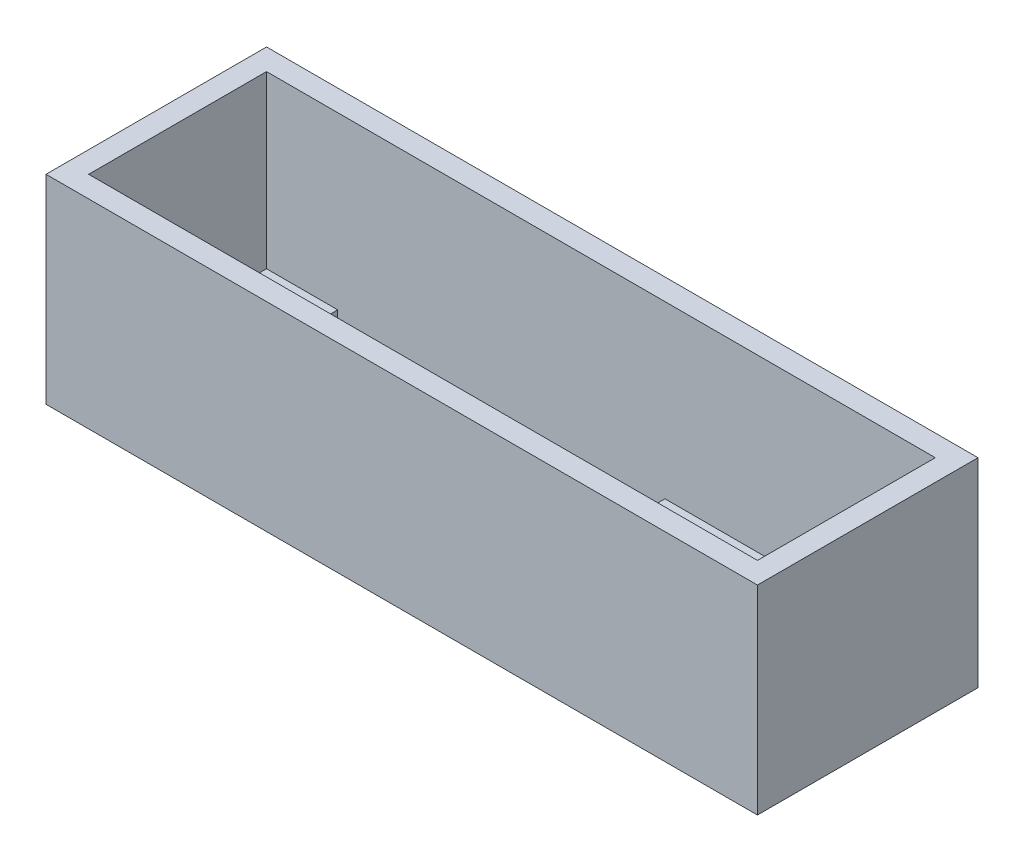
ISO-10303-21;
HEADER;
FILE_DESCRIPTION(('STEP AP214'),'2;1');
FILE_NAME('part.step','',(''),(''),'','','');
FILE_SCHEMA(('AUTOMOTIVE_DESIGN { 1 0 10303 214 1 1 1 1 }'));
ENDSEC;
DATA;
#1=APPLICATION_CONTEXT('core data for automotive mechanical design processes');
#2=APPLICATION_PROTOCOL_DEFINITION('international standard','automotive_design',2000,#1);
#3=PRODUCT_CONTEXT('',#1,'mechanical');
#4=PRODUCT('Part','Part','',(#3));
#5=PRODUCT_RELATED_PRODUCT_CATEGORY('part','',(#4));
#6=PRODUCT_DEFINITION_FORMATION('','',#4);
#7=PRODUCT_DEFINITION_CONTEXT('part definition',#1,'design');
#8=PRODUCT_DEFINITION('design','',#6,#7);
#9=PRODUCT_DEFINITION_SHAPE('','',#8);
#10=(LENGTH_UNIT() NAMED_UNIT(*) SI_UNIT(.MILLI.,.METRE.));
#11=(NAMED_UNIT(*) PLANE_ANGLE_UNIT() SI_UNIT($,.RADIAN.));
#12=(NAMED_UNIT(*) SI_UNIT($,.STERADIAN.) SOLID_ANGLE_UNIT());
#13=UNCERTAINTY_MEASURE_WITH_UNIT(LENGTH_MEASURE(1.E-05),#10,'distance_accuracy_value','');
#14=(GEOMETRIC_REPRESENTATION_CONTEXT(3) GLOBAL_UNCERTAINTY_ASSIGNED_CONTEXT((#13)) GLOBAL_UNIT_ASSIGNED_CONTEXT((#10,
#11,#12)) REPRESENTATION_CONTEXT('',''));
#15=CARTESIAN_POINT('',(0.,0.,0.));
#16=DIRECTION('',(0.,0.,1.));
#17=DIRECTION('',(1.,0.,0.));
#18=AXIS2_PLACEMENT_3D('',#15,#16,#17);
#19=CARTESIAN_POINT('',(0.,2.,0.));
#20=DIRECTION('',(0.,-1.,0.));
#21=DIRECTION('',(0.,0.,-1.));
#22=AXIS2_PLACEMENT_3D('',#19,#20,#21);
#23=PLANE('',#22);
#24=CARTESIAN_POINT('',(4.1,2.,-7.75));
#25=DIRECTION('',(0.,1.,0.));
#26=DIRECTION('',(0.,0.,1.));
#27=AXIS2_PLACEMENT_3D('',#24,#25,#26);
#28=CIRCLE('',#27,1.15);
#29=CARTESIAN_POINT('',(4.1,2.,-6.6));
#30=VERTEX_POINT('',#29);
#31=EDGE_CURVE('E421',#30,#30,#28,.T.);
#32=ORIENTED_EDGE('',*,*,#31,.F.);
#33=EDGE_LOOP('',(#32));
#34=FACE_BOUND('',#33,.T.);
#35=DIRECTION('',(0.,0.,1.));
#36=VECTOR('',#35,1.);
#37=CARTESIAN_POINT('',(6.5,2.,-14.));
#38=LINE('',#37,#36);
#39=CARTESIAN_POINT('',(6.5,2.,-14.));
#40=VERTEX_POINT('',#39);
#41=CARTESIAN_POINT('',(6.5,2.,-1.5));
#42=VERTEX_POINT('',#41);
#43=EDGE_CURVE('E130',#40,#42,#38,.T.);
#44=ORIENTED_EDGE('',*,*,#43,.F.);
#45=DIRECTION('',(-1.,0.,0.));
#46=VECTOR('',#45,1.);
#47=CARTESIAN_POINT('',(48.5,2.,-14.));
#48=LINE('',#47,#46);
#49=CARTESIAN_POINT('',(1.5,2.,-14.));
#50=VERTEX_POINT('',#49);
#51=EDGE_CURVE('E179',#40,#50,#48,.T.);
#52=ORIENTED_EDGE('',*,*,#51,.T.);
#53=DIRECTION('',(0.,0.,1.));
#54=VECTOR('',#53,1.);
#55=CARTESIAN_POINT('',(1.5,2.,-14.));
#56=LINE('',#55,#54);
#57=CARTESIAN_POINT('',(1.5,2.,-1.5));
#58=VERTEX_POINT('',#57);
#59=EDGE_CURVE('E163',#50,#58,#56,.T.);
#60=ORIENTED_EDGE('',*,*,#59,.T.);
#61=DIRECTION('',(1.,0.,0.));
#62=VECTOR('',#61,1.);
#63=CARTESIAN_POINT('',(1.5,2.,-1.5));
#64=LINE('',#63,#62);
#65=EDGE_CURVE('E185',#58,#42,#64,.T.);
#66=ORIENTED_EDGE('',*,*,#65,.T.);
#67=EDGE_LOOP('',(#44,#52,#60,#66));
#68=FACE_BOUND('',#67,.T.);
#69=ADVANCED_FACE('F35',(#34,#68),#23,.F.);
#70=CARTESIAN_POINT('',(31.9,2.,-7.75));
#71=DIRECTION('',(0.,1.,0.));
#72=DIRECTION('',(0.,0.,1.));
#73=AXIS2_PLACEMENT_3D('',#70,#71,#72);
#74=CIRCLE('',#73,1.15);
#75=CARTESIAN_POINT('',(31.9,2.,-6.6));
#76=VERTEX_POINT('',#75);
#77=EDGE_CURVE('E414',#76,#76,#74,.T.);
#78=ORIENTED_EDGE('',*,*,#77,.F.);
#79=EDGE_LOOP('',(#78));
#80=FACE_BOUND('',#79,.T.);
#81=CARTESIAN_POINT('',(39.65,2.,-7.75));
#82=DIRECTION('',(0.,1.,0.));
#83=DIRECTION('',(0.,0.,1.));
#84=AXIS2_PLACEMENT_3D('',#81,#82,#83);
#85=CIRCLE('',#84,1.80688229779694);
#86=CARTESIAN_POINT('',(39.65,2.,-5.94311770220306));
#87=VERTEX_POINT('',#86);
#88=EDGE_CURVE('E148',#87,#87,#85,.T.);
#89=ORIENTED_EDGE('',*,*,#88,.F.);
#90=EDGE_LOOP('',(#89));
#91=FACE_BOUND('',#90,.T.);
#92=DIRECTION('',(0.,0.,-1.));
#93=VECTOR('',#92,1.);
#94=CARTESIAN_POINT('',(29.5,2.,-14.));
#95=LINE('',#94,#93);
#96=CARTESIAN_POINT('',(29.5,2.,-1.5));
#97=VERTEX_POINT('',#96);
#98=CARTESIAN_POINT('',(29.5,2.,-14.));
#99=VERTEX_POINT('',#98);
#100=EDGE_CURVE('E144',#97,#99,#95,.T.);
#101=ORIENTED_EDGE('',*,*,#100,.F.);
#102=CARTESIAN_POINT('',(48.5,2.,-1.5));
#103=VERTEX_POINT('',#102);
#104=EDGE_CURVE('E187',#97,#103,#64,.T.);
#105=ORIENTED_EDGE('',*,*,#104,.T.);
#106=DIRECTION('',(0.,0.,-1.));
#107=VECTOR('',#106,1.);
#108=CARTESIAN_POINT('',(48.5,2.,-1.5));
#109=LINE('',#108,#107);
#110=CARTESIAN_POINT('',(48.5,2.,-14.));
#111=VERTEX_POINT('',#110);
#112=EDGE_CURVE('E180',#103,#111,#109,.T.);
#113=ORIENTED_EDGE('',*,*,#112,.T.);
#114=EDGE_CURVE('E175',#111,#99,#48,.T.);
#115=ORIENTED_EDGE('',*,*,#114,.T.);
#116=EDGE_LOOP('',(#101,#105,#113,#115));
#117=FACE_BOUND('',#116,.T.);
#118=ADVANCED_FACE('F242',(#80,#91,#117),#23,.F.);
#119=CARTESIAN_POINT('',(0.,14.,0.));
#120=DIRECTION('',(1.,0.,0.));
#121=DIRECTION('',(0.,0.,-1.));
#122=AXIS2_PLACEMENT_3D('',#119,#120,#121);
#123=PLANE('',#122);
#124=DIRECTION('',(0.,0.,1.));
#125=VECTOR('',#124,1.);
#126=CARTESIAN_POINT('',(0.,0.,0.));
#127=LINE('',#126,#125);
#128=CARTESIAN_POINT('',(0.,0.,-15.5));
#129=VERTEX_POINT('',#128);
#130=CARTESIAN_POINT('',(0.,0.,0.));
#131=VERTEX_POINT('',#130);
#132=EDGE_CURVE('E193',#129,#131,#127,.T.);
#133=ORIENTED_EDGE('',*,*,#132,.T.);
#134=DIRECTION('',(0.,-1.,0.));
#135=VECTOR('',#134,1.);
#136=CARTESIAN_POINT('',(0.,14.,0.));
#137=LINE('',#136,#135);
#138=CARTESIAN_POINT('',(0.,14.,0.));
#139=VERTEX_POINT('',#138);
#140=EDGE_CURVE('E12',#139,#131,#137,.T.);
#141=ORIENTED_EDGE('',*,*,#140,.F.);
#142=DIRECTION('',(0.,0.,1.));
#143=VECTOR('',#142,1.);
#144=CARTESIAN_POINT('',(0.,14.,0.));
#145=LINE('',#144,#143);
#146=CARTESIAN_POINT('',(0.,14.,-15.5));
#147=VERTEX_POINT('',#146);
#148=EDGE_CURVE('E194',#147,#139,#145,.T.);
#149=ORIENTED_EDGE('',*,*,#148,.F.);
#150=DIRECTION('',(0.,-1.,0.));
#151=VECTOR('',#150,1.);
#152=CARTESIAN_POINT('',(0.,14.,-15.5));
#153=LINE('',#152,#151);
#154=EDGE_CURVE('E204',#147,#129,#153,.T.);
#155=ORIENTED_EDGE('',*,*,#154,.T.);
#156=EDGE_LOOP('',(#133,#141,#149,#155));
#157=FACE_BOUND('',#156,.T.);
#158=ADVANCED_FACE('F37',(#157),#123,.F.);
#159=CARTESIAN_POINT('',(0.,14.,0.));
#160=DIRECTION('',(0.,0.,-1.));
#161=DIRECTION('',(-1.,0.,0.));
#162=AXIS2_PLACEMENT_3D('',#159,#160,#161);
#163=PLANE('',#162);
#164=DIRECTION('',(1.,0.,0.));
#165=VECTOR('',#164,1.);
#166=CARTESIAN_POINT('',(0.,0.,0.));
#167=LINE('',#166,#165);
#168=CARTESIAN_POINT('',(50.,0.,0.));
#169=VERTEX_POINT('',#168);
#170=EDGE_CURVE('E207',#131,#169,#167,.T.);
#171=ORIENTED_EDGE('',*,*,#170,.T.);
#172=DIRECTION('',(0.,-1.,0.));
#173=VECTOR('',#172,1.);
#174=CARTESIAN_POINT('',(50.,14.,0.));
#175=LINE('',#174,#173);
#176=CARTESIAN_POINT('',(50.,14.,0.));
#177=VERTEX_POINT('',#176);
#178=EDGE_CURVE('E43',#177,#169,#175,.T.);
#179=ORIENTED_EDGE('',*,*,#178,.F.);
#180=DIRECTION('',(1.,0.,0.));
#181=VECTOR('',#180,1.);
#182=CARTESIAN_POINT('',(0.,14.,0.));
#183=LINE('',#182,#181);
#184=EDGE_CURVE('E197',#139,#177,#183,.T.);
#185=ORIENTED_EDGE('',*,*,#184,.F.);
#186=ORIENTED_EDGE('',*,*,#140,.T.);
#187=EDGE_LOOP('',(#171,#179,#185,#186));
#188=FACE_BOUND('',#187,.T.);
#189=ADVANCED_FACE('F235',(#188),#163,.F.);
#190=CARTESIAN_POINT('',(50.,14.,0.));
#191=DIRECTION('',(-1.,0.,0.));
#192=DIRECTION('',(0.,0.,1.));
#193=AXIS2_PLACEMENT_3D('',#190,#191,#192);
#194=PLANE('',#193);
#195=DIRECTION('',(0.,0.,-1.));
#196=VECTOR('',#195,1.);
#197=CARTESIAN_POINT('',(50.,0.,0.));
#198=LINE('',#197,#196);
#199=CARTESIAN_POINT('',(50.,0.,-15.5));
#200=VERTEX_POINT('',#199);
#201=EDGE_CURVE('E209',#169,#200,#198,.T.);
#202=ORIENTED_EDGE('',*,*,#201,.T.);
#203=DIRECTION('',(0.,-1.,0.));
#204=VECTOR('',#203,1.);
#205=CARTESIAN_POINT('',(50.,14.,-15.5));
#206=LINE('',#205,#204);
#207=CARTESIAN_POINT('',(50.,14.,-15.5));
#208=VERTEX_POINT('',#207);
#209=EDGE_CURVE('E214',#208,#200,#206,.T.);
#210=ORIENTED_EDGE('',*,*,#209,.F.);
#211=DIRECTION('',(0.,0.,-1.));
#212=VECTOR('',#211,1.);
#213=CARTESIAN_POINT('',(50.,14.,0.));
#214=LINE('',#213,#212);
#215=EDGE_CURVE('E200',#177,#208,#214,.T.);
#216=ORIENTED_EDGE('',*,*,#215,.F.);
#217=ORIENTED_EDGE('',*,*,#178,.T.);
#218=EDGE_LOOP('',(#202,#210,#216,#217));
#219=FACE_BOUND('',#218,.T.);
#220=ADVANCED_FACE('F221',(#219),#194,.F.);
#221=CARTESIAN_POINT('',(0.,14.,-15.5));
#222=DIRECTION('',(0.,0.,1.));
#223=DIRECTION('',(1.,0.,0.));
#224=AXIS2_PLACEMENT_3D('',#221,#222,#223);
#225=PLANE('',#224);
#226=DIRECTION('',(-1.,0.,0.));
#227=VECTOR('',#226,1.);
#228=CARTESIAN_POINT('',(0.,0.,-15.5));
#229=LINE('',#228,#227);
#230=EDGE_CURVE('E198',#200,#129,#229,.T.);
#231=ORIENTED_EDGE('',*,*,#230,.T.);
#232=ORIENTED_EDGE('',*,*,#154,.F.);
#233=DIRECTION('',(-1.,0.,0.));
#234=VECTOR('',#233,1.);
#235=CARTESIAN_POINT('',(0.,14.,-15.5));
#236=LINE('',#235,#234);
#237=EDGE_CURVE('E202',#208,#147,#236,.T.);
#238=ORIENTED_EDGE('',*,*,#237,.F.);
#239=ORIENTED_EDGE('',*,*,#209,.T.);
#240=EDGE_LOOP('',(#231,#232,#238,#239));
#241=FACE_BOUND('',#240,.T.);
#242=ADVANCED_FACE('F228',(#241),#225,.F.);
#243=CARTESIAN_POINT('',(0.,14.,0.));
#244=DIRECTION('',(0.,-1.,0.));
#245=DIRECTION('',(0.,0.,-1.));
#246=AXIS2_PLACEMENT_3D('',#243,#244,#245);
#247=PLANE('',#246);
#248=DIRECTION('',(1.,0.,0.));
#249=VECTOR('',#248,1.);
#250=CARTESIAN_POINT('',(1.5,14.,-1.5));
#251=LINE('',#250,#249);
#252=CARTESIAN_POINT('',(1.5,14.,-1.5));
#253=VERTEX_POINT('',#252);
#254=CARTESIAN_POINT('',(48.5,14.,-1.5));
#255=VERTEX_POINT('',#254);
#256=EDGE_CURVE('E164',#253,#255,#251,.T.);
#257=ORIENTED_EDGE('',*,*,#256,.F.);
#258=DIRECTION('',(0.,0.,1.));
#259=VECTOR('',#258,1.);
#260=CARTESIAN_POINT('',(1.5,14.,-14.));
#261=LINE('',#260,#259);
#262=CARTESIAN_POINT('',(1.5,14.,-14.));
#263=VERTEX_POINT('',#262);
#264=EDGE_CURVE('E167',#263,#253,#261,.T.);
#265=ORIENTED_EDGE('',*,*,#264,.F.);
#266=DIRECTION('',(-1.,0.,0.));
#267=VECTOR('',#266,1.);
#268=CARTESIAN_POINT('',(48.5,14.,-14.));
#269=LINE('',#268,#267);
#270=CARTESIAN_POINT('',(48.5,14.,-14.));
#271=VERTEX_POINT('',#270);
#272=EDGE_CURVE('E157',#271,#263,#269,.T.);
#273=ORIENTED_EDGE('',*,*,#272,.F.);
#274=DIRECTION('',(0.,0.,-1.));
#275=VECTOR('',#274,1.);
#276=CARTESIAN_POINT('',(48.5,14.,-1.5));
#277=LINE('',#276,#275);
#278=EDGE_CURVE('E161',#255,#271,#277,.T.);
#279=ORIENTED_EDGE('',*,*,#278,.F.);
#280=EDGE_LOOP('',(#257,#265,#273,#279));
#281=FACE_BOUND('',#280,.T.);
#282=ORIENTED_EDGE('',*,*,#148,.T.);
#283=ORIENTED_EDGE('',*,*,#184,.T.);
#284=ORIENTED_EDGE('',*,*,#215,.T.);
#285=ORIENTED_EDGE('',*,*,#237,.T.);
#286=EDGE_LOOP('',(#282,#283,#284,#285));
#287=FACE_BOUND('',#286,.T.);
#288=ADVANCED_FACE('F234',(#281,#287),#247,.F.);
#289=CARTESIAN_POINT('',(0.,0.,0.));
#290=DIRECTION('',(0.,-1.,0.));
#291=DIRECTION('',(0.,0.,-1.));
#292=AXIS2_PLACEMENT_3D('',#289,#290,#291);
#293=PLANE('',#292);
#294=CARTESIAN_POINT('',(39.65,0.,-7.75));
#295=DIRECTION('',(0.,1.,0.));
#296=DIRECTION('',(0.,0.,1.));
#297=AXIS2_PLACEMENT_3D('',#294,#295,#296);
#298=CIRCLE('',#297,1.80688229779694);
#299=CARTESIAN_POINT('',(39.65,0.,-5.94311770220306));
#300=VERTEX_POINT('',#299);
#301=EDGE_CURVE('E410',#300,#300,#298,.T.);
#302=ORIENTED_EDGE('',*,*,#301,.T.);
#303=EDGE_LOOP('',(#302));
#304=FACE_BOUND('',#303,.T.);
#305=CARTESIAN_POINT('',(31.9,0.,-7.75));
#306=DIRECTION('',(0.,1.,0.));
#307=DIRECTION('',(0.,0.,1.));
#308=AXIS2_PLACEMENT_3D('',#305,#306,#307);
#309=CIRCLE('',#308,1.15);
#310=CARTESIAN_POINT('',(31.9,0.,-6.6));
#311=VERTEX_POINT('',#310);
#312=EDGE_CURVE('E416',#311,#311,#309,.T.);
#313=ORIENTED_EDGE('',*,*,#312,.T.);
#314=EDGE_LOOP('',(#313));
#315=FACE_BOUND('',#314,.T.);
#316=CARTESIAN_POINT('',(4.1,0.,-7.75));
#317=DIRECTION('',(0.,1.,0.));
#318=DIRECTION('',(0.,0.,1.));
#319=AXIS2_PLACEMENT_3D('',#316,#317,#318);
#320=CIRCLE('',#319,1.15);
#321=CARTESIAN_POINT('',(4.1,0.,-6.6));
#322=VERTEX_POINT('',#321);
#323=EDGE_CURVE('E153',#322,#322,#320,.T.);
#324=ORIENTED_EDGE('',*,*,#323,.T.);
#325=EDGE_LOOP('',(#324));
#326=FACE_BOUND('',#325,.T.);
#327=DIRECTION('',(0.,0.,1.));
#328=VECTOR('',#327,1.);
#329=CARTESIAN_POINT('',(6.5,0.,-14.));
#330=LINE('',#329,#328);
#331=CARTESIAN_POINT('',(6.5,0.,-14.));
#332=VERTEX_POINT('',#331);
#333=CARTESIAN_POINT('',(6.5,0.,-1.5));
#334=VERTEX_POINT('',#333);
#335=EDGE_CURVE('E127',#332,#334,#330,.T.);
#336=ORIENTED_EDGE('',*,*,#335,.T.);
#337=DIRECTION('',(1.,0.,0.));
#338=VECTOR('',#337,1.);
#339=CARTESIAN_POINT('',(6.5,0.,-1.5));
#340=LINE('',#339,#338);
#341=CARTESIAN_POINT('',(29.5,0.,-1.5));
#342=VERTEX_POINT('',#341);
#343=EDGE_CURVE('E136',#334,#342,#340,.T.);
#344=ORIENTED_EDGE('',*,*,#343,.T.);
#345=DIRECTION('',(0.,0.,-1.));
#346=VECTOR('',#345,1.);
#347=CARTESIAN_POINT('',(29.5,0.,-14.));
#348=LINE('',#347,#346);
#349=CARTESIAN_POINT('',(29.5,0.,-14.));
#350=VERTEX_POINT('',#349);
#351=EDGE_CURVE('E50',#342,#350,#348,.T.);
#352=ORIENTED_EDGE('',*,*,#351,.T.);
#353=DIRECTION('',(-1.,0.,0.));
#354=VECTOR('',#353,1.);
#355=CARTESIAN_POINT('',(6.5,0.,-14.));
#356=LINE('',#355,#354);
#357=EDGE_CURVE('E133',#350,#332,#356,.T.);
#358=ORIENTED_EDGE('',*,*,#357,.T.);
#359=EDGE_LOOP('',(#336,#344,#352,#358));
#360=FACE_BOUND('',#359,.T.);
#361=ORIENTED_EDGE('',*,*,#132,.F.);
#362=ORIENTED_EDGE('',*,*,#230,.F.);
#363=ORIENTED_EDGE('',*,*,#201,.F.);
#364=ORIENTED_EDGE('',*,*,#170,.F.);
#365=EDGE_LOOP('',(#361,#362,#363,#364));
#366=FACE_BOUND('',#365,.T.);
#367=ADVANCED_FACE('F141',(#304,#315,#326,#360,#366),#293,.T.);
#368=CARTESIAN_POINT('',(1.5,-48.6338359581064,-14.));
#369=DIRECTION('',(-1.,0.,0.));
#370=DIRECTION('',(0.,0.,1.));
#371=AXIS2_PLACEMENT_3D('',#368,#369,#370);
#372=PLANE('',#371);
#373=DIRECTION('',(0.,1.,0.));
#374=VECTOR('',#373,1.);
#375=CARTESIAN_POINT('',(1.5,-48.6338359581064,-14.));
#376=LINE('',#375,#374);
#377=EDGE_CURVE('E178',#50,#263,#376,.T.);
#378=ORIENTED_EDGE('',*,*,#377,.T.);
#379=ORIENTED_EDGE('',*,*,#264,.T.);
#380=DIRECTION('',(0.,1.,0.));
#381=VECTOR('',#380,1.);
#382=CARTESIAN_POINT('',(1.5,-48.6338359581064,-1.5));
#383=LINE('',#382,#381);
#384=EDGE_CURVE('E174',#58,#253,#383,.T.);
#385=ORIENTED_EDGE('',*,*,#384,.F.);
#386=ORIENTED_EDGE('',*,*,#59,.F.);
#387=EDGE_LOOP('',(#378,#379,#385,#386));
#388=FACE_BOUND('',#387,.T.);
#389=ADVANCED_FACE('F254',(#388),#372,.F.);
#390=CARTESIAN_POINT('',(1.5,-48.6338359581064,-1.5));
#391=DIRECTION('',(0.,0.,1.));
#392=DIRECTION('',(1.,0.,0.));
#393=AXIS2_PLACEMENT_3D('',#390,#391,#392);
#394=PLANE('',#393);
#395=ORIENTED_EDGE('',*,*,#384,.T.);
#396=ORIENTED_EDGE('',*,*,#256,.T.);
#397=DIRECTION('',(0.,1.,0.));
#398=VECTOR('',#397,1.);
#399=CARTESIAN_POINT('',(48.5,-48.6338359581064,-1.5));
#400=LINE('',#399,#398);
#401=EDGE_CURVE('E184',#103,#255,#400,.T.);
#402=ORIENTED_EDGE('',*,*,#401,.F.);
#403=ORIENTED_EDGE('',*,*,#104,.F.);
#404=DIRECTION('',(0.,1.,0.));
#405=VECTOR('',#404,1.);
#406=CARTESIAN_POINT('',(29.5,0.,-1.5));
#407=LINE('',#406,#405);
#408=EDGE_CURVE('E54',#342,#97,#407,.T.);
#409=ORIENTED_EDGE('',*,*,#408,.F.);
#410=ORIENTED_EDGE('',*,*,#343,.F.);
#411=DIRECTION('',(0.,1.,0.));
#412=VECTOR('',#411,1.);
#413=CARTESIAN_POINT('',(6.5,0.,-1.5));
#414=LINE('',#413,#412);
#415=EDGE_CURVE('E123',#334,#42,#414,.T.);
#416=ORIENTED_EDGE('',*,*,#415,.T.);
#417=ORIENTED_EDGE('',*,*,#65,.F.);
#418=EDGE_LOOP('',(#395,#396,#402,#403,#409,#410,#416,#417));
#419=FACE_BOUND('',#418,.T.);
#420=ADVANCED_FACE('F137',(#419),#394,.F.);
#421=CARTESIAN_POINT('',(48.5,-48.6338359581064,-1.5));
#422=DIRECTION('',(1.,0.,0.));
#423=DIRECTION('',(0.,0.,-1.));
#424=AXIS2_PLACEMENT_3D('',#421,#422,#423);
#425=PLANE('',#424);
#426=ORIENTED_EDGE('',*,*,#401,.T.);
#427=ORIENTED_EDGE('',*,*,#278,.T.);
#428=DIRECTION('',(0.,1.,0.));
#429=VECTOR('',#428,1.);
#430=CARTESIAN_POINT('',(48.5,-48.6338359581064,-14.));
#431=LINE('',#430,#429);
#432=EDGE_CURVE('E183',#111,#271,#431,.T.);
#433=ORIENTED_EDGE('',*,*,#432,.F.);
#434=ORIENTED_EDGE('',*,*,#112,.F.);
#435=EDGE_LOOP('',(#426,#427,#433,#434));
#436=FACE_BOUND('',#435,.T.);
#437=ADVANCED_FACE('F289',(#436),#425,.F.);
#438=CARTESIAN_POINT('',(48.5,-48.6338359581064,-14.));
#439=DIRECTION('',(0.,0.,-1.));
#440=DIRECTION('',(-1.,0.,0.));
#441=AXIS2_PLACEMENT_3D('',#438,#439,#440);
#442=PLANE('',#441);
#443=ORIENTED_EDGE('',*,*,#432,.T.);
#444=ORIENTED_EDGE('',*,*,#272,.T.);
#445=ORIENTED_EDGE('',*,*,#377,.F.);
#446=ORIENTED_EDGE('',*,*,#51,.F.);
#447=DIRECTION('',(0.,1.,0.));
#448=VECTOR('',#447,1.);
#449=CARTESIAN_POINT('',(6.5,0.,-14.));
#450=LINE('',#449,#448);
#451=EDGE_CURVE('E155',#332,#40,#450,.T.);
#452=ORIENTED_EDGE('',*,*,#451,.F.);
#453=ORIENTED_EDGE('',*,*,#357,.F.);
#454=DIRECTION('',(0.,1.,0.));
#455=VECTOR('',#454,1.);
#456=CARTESIAN_POINT('',(29.5,0.,-14.));
#457=LINE('',#456,#455);
#458=EDGE_CURVE('E158',#350,#99,#457,.T.);
#459=ORIENTED_EDGE('',*,*,#458,.T.);
#460=ORIENTED_EDGE('',*,*,#114,.F.);
#461=EDGE_LOOP('',(#443,#444,#445,#446,#452,#453,#459,#460));
#462=FACE_BOUND('',#461,.T.);
#463=ADVANCED_FACE('F295',(#462),#442,.F.);
#464=CARTESIAN_POINT('',(4.1,0.,-7.75));
#465=DIRECTION('',(0.,1.,0.));
#466=DIRECTION('',(0.,0.,1.));
#467=AXIS2_PLACEMENT_3D('',#464,#465,#466);
#468=CYLINDRICAL_SURFACE('',#467,1.15);
#469=ORIENTED_EDGE('',*,*,#323,.F.);
#470=EDGE_LOOP('',(#469));
#471=FACE_BOUND('',#470,.T.);
#472=ORIENTED_EDGE('',*,*,#31,.T.);
#473=EDGE_LOOP('',(#472));
#474=FACE_BOUND('',#473,.T.);
#475=ADVANCED_FACE('F302',(#471,#474),#468,.F.);
#476=CARTESIAN_POINT('',(31.9,0.,-7.75));
#477=DIRECTION('',(0.,1.,0.));
#478=DIRECTION('',(0.,0.,1.));
#479=AXIS2_PLACEMENT_3D('',#476,#477,#478);
#480=CYLINDRICAL_SURFACE('',#479,1.15);
#481=ORIENTED_EDGE('',*,*,#312,.F.);
#482=EDGE_LOOP('',(#481));
#483=FACE_BOUND('',#482,.T.);
#484=ORIENTED_EDGE('',*,*,#77,.T.);
#485=EDGE_LOOP('',(#484));
#486=FACE_BOUND('',#485,.T.);
#487=ADVANCED_FACE('F310',(#483,#486),#480,.F.);
#488=CARTESIAN_POINT('',(39.65,0.,-7.75));
#489=DIRECTION('',(0.,1.,0.));
#490=DIRECTION('',(0.,0.,1.));
#491=AXIS2_PLACEMENT_3D('',#488,#489,#490);
#492=CYLINDRICAL_SURFACE('',#491,1.80688229779694);
#493=ORIENTED_EDGE('',*,*,#301,.F.);
#494=EDGE_LOOP('',(#493));
#495=FACE_BOUND('',#494,.T.);
#496=ORIENTED_EDGE('',*,*,#88,.T.);
#497=EDGE_LOOP('',(#496));
#498=FACE_BOUND('',#497,.T.);
#499=ADVANCED_FACE('F318',(#495,#498),#492,.F.);
#500=CARTESIAN_POINT('',(6.5,0.,-14.));
#501=DIRECTION('',(-1.,0.,0.));
#502=DIRECTION('',(0.,0.,1.));
#503=AXIS2_PLACEMENT_3D('',#500,#501,#502);
#504=PLANE('',#503);
#505=ORIENTED_EDGE('',*,*,#43,.T.);
#506=ORIENTED_EDGE('',*,*,#415,.F.);
#507=ORIENTED_EDGE('',*,*,#335,.F.);
#508=ORIENTED_EDGE('',*,*,#451,.T.);
#509=EDGE_LOOP('',(#505,#506,#507,#508));
#510=FACE_BOUND('',#509,.T.);
#511=ADVANCED_FACE('F125',(#510),#504,.F.);
#512=CARTESIAN_POINT('',(29.5,0.,-14.));
#513=DIRECTION('',(1.,0.,0.));
#514=DIRECTION('',(0.,0.,-1.));
#515=AXIS2_PLACEMENT_3D('',#512,#513,#514);
#516=PLANE('',#515);
#517=ORIENTED_EDGE('',*,*,#100,.T.);
#518=ORIENTED_EDGE('',*,*,#458,.F.);
#519=ORIENTED_EDGE('',*,*,#351,.F.);
#520=ORIENTED_EDGE('',*,*,#408,.T.);
#521=EDGE_LOOP('',(#517,#518,#519,#520));
#522=FACE_BOUND('',#521,.T.);
#523=ADVANCED_FACE('F333',(#522),#516,.F.);
#524=CLOSED_SHELL('',(#69,#118,#158,#189,#220,#242,#288,#367,#389,#420,#437,#463,#475,#487,#499,
#511,#523));
#525=MANIFOLD_SOLID_BREP('B2',#524);
#526=ADVANCED_BREP_SHAPE_REPRESENTATION('',(#18,#525),#14);
#527=SHAPE_DEFINITION_REPRESENTATION(#9,#526);
ENDSEC;
END-ISO-10303-21;
